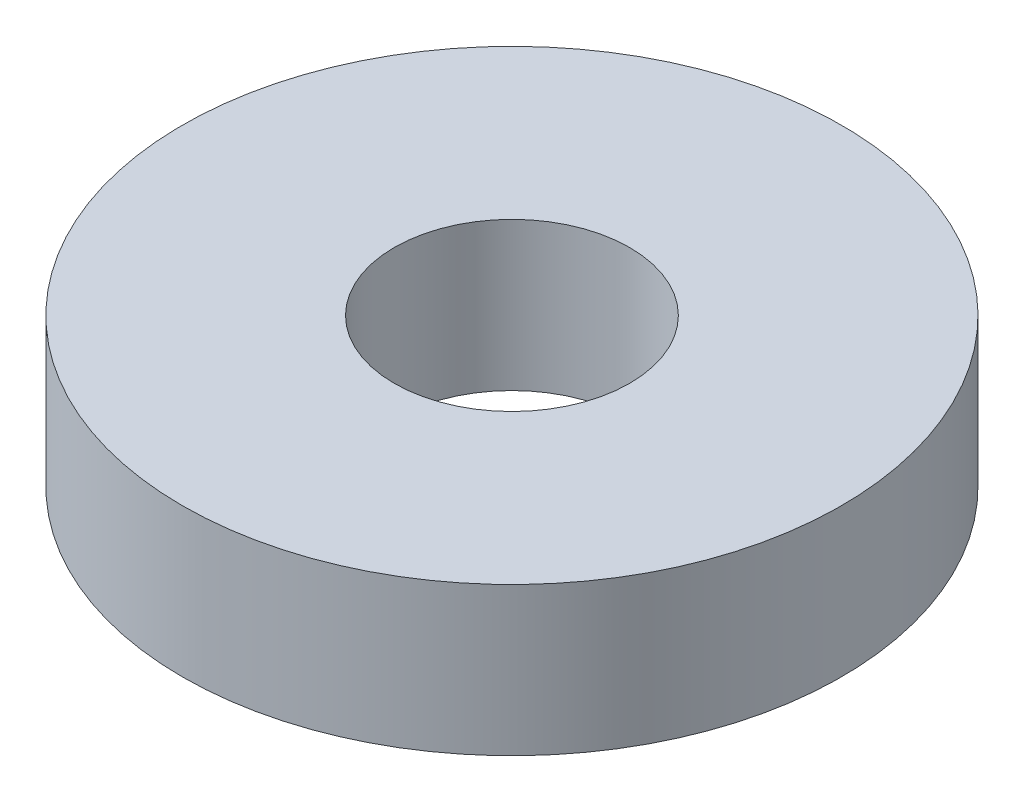
ISO-10303-21;
HEADER;
FILE_DESCRIPTION(('STEP AP214'),'2;1');
FILE_NAME('part.step','',(''),(''),'','','');
FILE_SCHEMA(('AUTOMOTIVE_DESIGN { 1 0 10303 214 1 1 1 1 }'));
ENDSEC;
DATA;
#1=APPLICATION_CONTEXT('core data for automotive mechanical design processes');
#2=APPLICATION_PROTOCOL_DEFINITION('international standard','automotive_design',2000,#1);
#3=PRODUCT_CONTEXT('',#1,'mechanical');
#4=PRODUCT('Part','Part','',(#3));
#5=PRODUCT_RELATED_PRODUCT_CATEGORY('part','',(#4));
#6=PRODUCT_DEFINITION_FORMATION('','',#4);
#7=PRODUCT_DEFINITION_CONTEXT('part definition',#1,'design');
#8=PRODUCT_DEFINITION('design','',#6,#7);
#9=PRODUCT_DEFINITION_SHAPE('','',#8);
#10=(LENGTH_UNIT() NAMED_UNIT(*) SI_UNIT(.MILLI.,.METRE.));
#11=(NAMED_UNIT(*) PLANE_ANGLE_UNIT() SI_UNIT($,.RADIAN.));
#12=(NAMED_UNIT(*) SI_UNIT($,.STERADIAN.) SOLID_ANGLE_UNIT());
#13=UNCERTAINTY_MEASURE_WITH_UNIT(LENGTH_MEASURE(1.E-05),#10,'distance_accuracy_value','');
#14=(GEOMETRIC_REPRESENTATION_CONTEXT(3) GLOBAL_UNCERTAINTY_ASSIGNED_CONTEXT((#13)) GLOBAL_UNIT_ASSIGNED_CONTEXT((#10,
#11,#12)) REPRESENTATION_CONTEXT('',''));
#15=CARTESIAN_POINT('',(0.,0.,0.));
#16=DIRECTION('',(0.,0.,1.));
#17=DIRECTION('',(1.,0.,0.));
#18=AXIS2_PLACEMENT_3D('',#15,#16,#17);
#19=CARTESIAN_POINT('',(0.,3.,0.));
#20=DIRECTION('',(0.,1.,0.));
#21=DIRECTION('',(0.,0.,1.));
#22=AXIS2_PLACEMENT_3D('',#19,#20,#21);
#23=PLANE('',#22);
#24=CARTESIAN_POINT('',(0.,3.,0.));
#25=DIRECTION('',(0.,1.,0.));
#26=DIRECTION('',(0.,0.,1.));
#27=AXIS2_PLACEMENT_3D('',#24,#25,#26);
#28=CIRCLE('',#27,6.6675);
#29=CARTESIAN_POINT('',(0.,3.,6.6675));
#30=VERTEX_POINT('',#29);
#31=EDGE_CURVE('E10',#30,#30,#28,.T.);
#32=ORIENTED_EDGE('',*,*,#31,.T.);
#33=EDGE_LOOP('',(#32));
#34=FACE_BOUND('',#33,.T.);
#35=CARTESIAN_POINT('',(0.,3.,0.));
#36=DIRECTION('',(0.,1.,0.));
#37=DIRECTION('',(0.,0.,1.));
#38=AXIS2_PLACEMENT_3D('',#35,#36,#37);
#39=CIRCLE('',#38,2.38125);
#40=CARTESIAN_POINT('',(0.,3.,2.38125));
#41=VERTEX_POINT('',#40);
#42=EDGE_CURVE('E50',#41,#41,#39,.T.);
#43=ORIENTED_EDGE('',*,*,#42,.F.);
#44=EDGE_LOOP('',(#43));
#45=FACE_BOUND('',#44,.T.);
#46=ADVANCED_FACE('F37',(#34,#45),#23,.T.);
#47=CARTESIAN_POINT('',(0.,0.,0.));
#48=DIRECTION('',(0.,1.,0.));
#49=DIRECTION('',(0.,0.,1.));
#50=AXIS2_PLACEMENT_3D('',#47,#48,#49);
#51=PLANE('',#50);
#52=CARTESIAN_POINT('',(0.,0.,0.));
#53=DIRECTION('',(0.,1.,0.));
#54=DIRECTION('',(0.,0.,1.));
#55=AXIS2_PLACEMENT_3D('',#52,#53,#54);
#56=CIRCLE('',#55,6.6675);
#57=CARTESIAN_POINT('',(0.,0.,6.6675));
#58=VERTEX_POINT('',#57);
#59=EDGE_CURVE('E41',#58,#58,#56,.T.);
#60=ORIENTED_EDGE('',*,*,#59,.F.);
#61=EDGE_LOOP('',(#60));
#62=FACE_BOUND('',#61,.T.);
#63=CARTESIAN_POINT('',(0.,0.,0.));
#64=DIRECTION('',(0.,1.,0.));
#65=DIRECTION('',(0.,0.,1.));
#66=AXIS2_PLACEMENT_3D('',#63,#64,#65);
#67=CIRCLE('',#66,2.38125);
#68=CARTESIAN_POINT('',(0.,0.,2.38125));
#69=VERTEX_POINT('',#68);
#70=EDGE_CURVE('E52',#69,#69,#67,.T.);
#71=ORIENTED_EDGE('',*,*,#70,.T.);
#72=EDGE_LOOP('',(#71));
#73=FACE_BOUND('',#72,.T.);
#74=ADVANCED_FACE('F64',(#62,#73),#51,.F.);
#75=CARTESIAN_POINT('',(0.,3.,0.));
#76=DIRECTION('',(0.,-1.,0.));
#77=DIRECTION('',(0.,0.,-1.));
#78=AXIS2_PLACEMENT_3D('',#75,#76,#77);
#79=CYLINDRICAL_SURFACE('',#78,6.6675);
#80=ORIENTED_EDGE('',*,*,#31,.F.);
#81=EDGE_LOOP('',(#80));
#82=FACE_BOUND('',#81,.T.);
#83=ORIENTED_EDGE('',*,*,#59,.T.);
#84=EDGE_LOOP('',(#83));
#85=FACE_BOUND('',#84,.T.);
#86=ADVANCED_FACE('F39',(#82,#85),#79,.T.);
#87=CARTESIAN_POINT('',(0.,3.,0.));
#88=DIRECTION('',(0.,-1.,0.));
#89=DIRECTION('',(0.,0.,-1.));
#90=AXIS2_PLACEMENT_3D('',#87,#88,#89);
#91=CYLINDRICAL_SURFACE('',#90,2.38125);
#92=ORIENTED_EDGE('',*,*,#42,.T.);
#93=EDGE_LOOP('',(#92));
#94=FACE_BOUND('',#93,.T.);
#95=ORIENTED_EDGE('',*,*,#70,.F.);
#96=EDGE_LOOP('',(#95));
#97=FACE_BOUND('',#96,.T.);
#98=ADVANCED_FACE('F60',(#94,#97),#91,.F.);
#99=CLOSED_SHELL('',(#46,#74,#86,#98));
#100=MANIFOLD_SOLID_BREP('B2',#99);
#101=ADVANCED_BREP_SHAPE_REPRESENTATION('',(#18,#100),#14);
#102=SHAPE_DEFINITION_REPRESENTATION(#9,#101);
ENDSEC;
END-ISO-10303-21;
